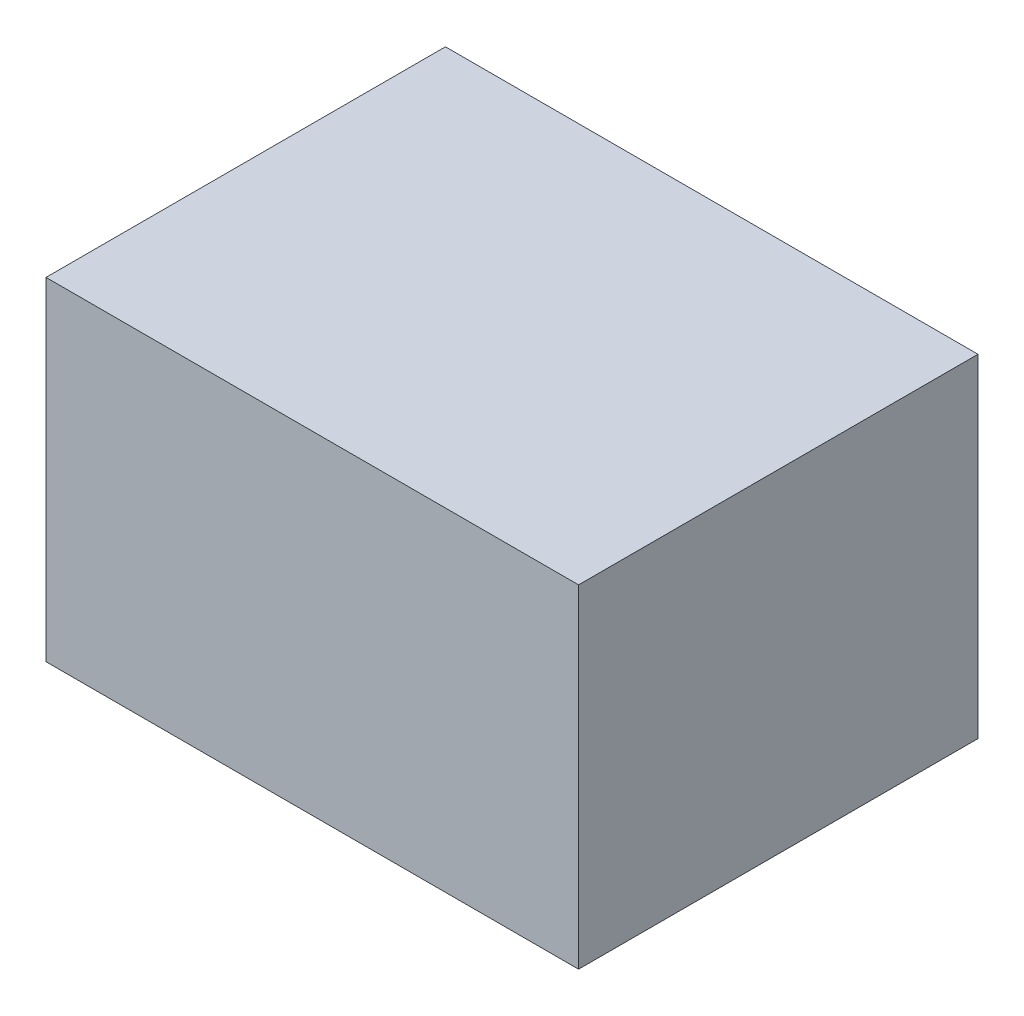
ISO-10303-21;
HEADER;
FILE_DESCRIPTION(('STEP AP214'),'2;1');
FILE_NAME('part.step','',(''),(''),'','','');
FILE_SCHEMA(('AUTOMOTIVE_DESIGN { 1 0 10303 214 1 1 1 1 }'));
ENDSEC;
DATA;
#1=APPLICATION_CONTEXT('core data for automotive mechanical design processes');
#2=APPLICATION_PROTOCOL_DEFINITION('international standard','automotive_design',2000,#1);
#3=PRODUCT_CONTEXT('',#1,'mechanical');
#4=PRODUCT('Part','Part','',(#3));
#5=PRODUCT_RELATED_PRODUCT_CATEGORY('part','',(#4));
#6=PRODUCT_DEFINITION_FORMATION('','',#4);
#7=PRODUCT_DEFINITION_CONTEXT('part definition',#1,'design');
#8=PRODUCT_DEFINITION('design','',#6,#7);
#9=PRODUCT_DEFINITION_SHAPE('','',#8);
#10=(LENGTH_UNIT() NAMED_UNIT(*) SI_UNIT(.MILLI.,.METRE.));
#11=(NAMED_UNIT(*) PLANE_ANGLE_UNIT() SI_UNIT($,.RADIAN.));
#12=(NAMED_UNIT(*) SI_UNIT($,.STERADIAN.) SOLID_ANGLE_UNIT());
#13=UNCERTAINTY_MEASURE_WITH_UNIT(LENGTH_MEASURE(1.E-05),#10,'distance_accuracy_value','');
#14=(GEOMETRIC_REPRESENTATION_CONTEXT(3) GLOBAL_UNCERTAINTY_ASSIGNED_CONTEXT((#13)) GLOBAL_UNIT_ASSIGNED_CONTEXT((#10,
#11,#12)) REPRESENTATION_CONTEXT('',''));
#15=CARTESIAN_POINT('',(0.,0.,0.));
#16=DIRECTION('',(0.,0.,1.));
#17=DIRECTION('',(1.,0.,0.));
#18=AXIS2_PLACEMENT_3D('',#15,#16,#17);
#19=CARTESIAN_POINT('',(0.999998,0.6249924,1.499997));
#20=DIRECTION('',(-1.,0.,0.));
#21=DIRECTION('',(0.,0.,1.));
#22=AXIS2_PLACEMENT_3D('',#19,#20,#21);
#23=PLANE('',#22);
#24=DIRECTION('',(0.,1.,0.));
#25=VECTOR('',#24,1.);
#26=CARTESIAN_POINT('',(0.999998,0.6249924,0.));
#27=LINE('',#26,#25);
#28=CARTESIAN_POINT('',(0.999998,-0.6249924,0.));
#29=VERTEX_POINT('',#28);
#30=CARTESIAN_POINT('',(0.999998,0.6249924,0.));
#31=VERTEX_POINT('',#30);
#32=EDGE_CURVE('E95',#29,#31,#27,.T.);
#33=ORIENTED_EDGE('',*,*,#32,.T.);
#34=DIRECTION('',(0.,0.,-1.));
#35=VECTOR('',#34,1.);
#36=CARTESIAN_POINT('',(0.999998,0.6249924,1.499997));
#37=LINE('',#36,#35);
#38=CARTESIAN_POINT('',(0.999998,0.6249924,1.499997));
#39=VERTEX_POINT('',#38);
#40=EDGE_CURVE('E11',#39,#31,#37,.T.);
#41=ORIENTED_EDGE('',*,*,#40,.F.);
#42=DIRECTION('',(0.,1.,0.));
#43=VECTOR('',#42,1.);
#44=CARTESIAN_POINT('',(0.999998,0.6249924,1.499997));
#45=LINE('',#44,#43);
#46=CARTESIAN_POINT('',(0.999998,-0.6249924,1.499997));
#47=VERTEX_POINT('',#46);
#48=EDGE_CURVE('E83',#47,#39,#45,.T.);
#49=ORIENTED_EDGE('',*,*,#48,.F.);
#50=DIRECTION('',(0.,0.,-1.));
#51=VECTOR('',#50,1.);
#52=CARTESIAN_POINT('',(0.999998,-0.6249924,1.499997));
#53=LINE('',#52,#51);
#54=EDGE_CURVE('E91',#47,#29,#53,.T.);
#55=ORIENTED_EDGE('',*,*,#54,.T.);
#56=EDGE_LOOP('',(#33,#41,#49,#55));
#57=FACE_BOUND('',#56,.T.);
#58=ADVANCED_FACE('F32',(#57),#23,.F.);
#59=CARTESIAN_POINT('',(-0.999998,0.6249924,1.499997));
#60=DIRECTION('',(0.,-1.,0.));
#61=DIRECTION('',(0.,0.,-1.));
#62=AXIS2_PLACEMENT_3D('',#59,#60,#61);
#63=PLANE('',#62);
#64=DIRECTION('',(-1.,0.,0.));
#65=VECTOR('',#64,1.);
#66=CARTESIAN_POINT('',(-0.999998,0.6249924,0.));
#67=LINE('',#66,#65);
#68=CARTESIAN_POINT('',(-0.999998,0.6249924,0.));
#69=VERTEX_POINT('',#68);
#70=EDGE_CURVE('E87',#31,#69,#67,.T.);
#71=ORIENTED_EDGE('',*,*,#70,.T.);
#72=DIRECTION('',(0.,0.,-1.));
#73=VECTOR('',#72,1.);
#74=CARTESIAN_POINT('',(-0.999998,0.6249924,1.499997));
#75=LINE('',#74,#73);
#76=CARTESIAN_POINT('',(-0.999998,0.6249924,1.499997));
#77=VERTEX_POINT('',#76);
#78=EDGE_CURVE('E40',#77,#69,#75,.T.);
#79=ORIENTED_EDGE('',*,*,#78,.F.);
#80=DIRECTION('',(-1.,0.,0.));
#81=VECTOR('',#80,1.);
#82=CARTESIAN_POINT('',(-0.999998,0.6249924,1.499997));
#83=LINE('',#82,#81);
#84=EDGE_CURVE('E78',#39,#77,#83,.T.);
#85=ORIENTED_EDGE('',*,*,#84,.F.);
#86=ORIENTED_EDGE('',*,*,#40,.T.);
#87=EDGE_LOOP('',(#71,#79,#85,#86));
#88=FACE_BOUND('',#87,.T.);
#89=ADVANCED_FACE('F86',(#88),#63,.F.);
#90=CARTESIAN_POINT('',(-0.999998,-0.6249924,1.499997));
#91=DIRECTION('',(1.,0.,0.));
#92=DIRECTION('',(0.,0.,-1.));
#93=AXIS2_PLACEMENT_3D('',#90,#91,#92);
#94=PLANE('',#93);
#95=DIRECTION('',(0.,-1.,0.));
#96=VECTOR('',#95,1.);
#97=CARTESIAN_POINT('',(-0.999998,-0.6249924,0.));
#98=LINE('',#97,#96);
#99=CARTESIAN_POINT('',(-0.999998,-0.6249924,0.));
#100=VERTEX_POINT('',#99);
#101=EDGE_CURVE('E65',#69,#100,#98,.T.);
#102=ORIENTED_EDGE('',*,*,#101,.T.);
#103=DIRECTION('',(0.,0.,-1.));
#104=VECTOR('',#103,1.);
#105=CARTESIAN_POINT('',(-0.999998,-0.6249924,1.499997));
#106=LINE('',#105,#104);
#107=CARTESIAN_POINT('',(-0.999998,-0.6249924,1.499997));
#108=VERTEX_POINT('',#107);
#109=EDGE_CURVE('E88',#108,#100,#106,.T.);
#110=ORIENTED_EDGE('',*,*,#109,.F.);
#111=DIRECTION('',(0.,-1.,0.));
#112=VECTOR('',#111,1.);
#113=CARTESIAN_POINT('',(-0.999998,-0.6249924,1.499997));
#114=LINE('',#113,#112);
#115=EDGE_CURVE('E81',#77,#108,#114,.T.);
#116=ORIENTED_EDGE('',*,*,#115,.F.);
#117=ORIENTED_EDGE('',*,*,#78,.T.);
#118=EDGE_LOOP('',(#102,#110,#116,#117));
#119=FACE_BOUND('',#118,.T.);
#120=ADVANCED_FACE('F89',(#119),#94,.F.);
#121=CARTESIAN_POINT('',(0.999998,-0.6249924,1.499997));
#122=DIRECTION('',(0.,1.,0.));
#123=DIRECTION('',(0.,0.,1.));
#124=AXIS2_PLACEMENT_3D('',#121,#122,#123);
#125=PLANE('',#124);
#126=DIRECTION('',(1.,0.,0.));
#127=VECTOR('',#126,1.);
#128=CARTESIAN_POINT('',(0.999998,-0.6249924,0.));
#129=LINE('',#128,#127);
#130=EDGE_CURVE('E71',#100,#29,#129,.T.);
#131=ORIENTED_EDGE('',*,*,#130,.T.);
#132=ORIENTED_EDGE('',*,*,#54,.F.);
#133=DIRECTION('',(1.,0.,0.));
#134=VECTOR('',#133,1.);
#135=CARTESIAN_POINT('',(0.999998,-0.6249924,1.499997));
#136=LINE('',#135,#134);
#137=EDGE_CURVE('E48',#108,#47,#136,.T.);
#138=ORIENTED_EDGE('',*,*,#137,.F.);
#139=ORIENTED_EDGE('',*,*,#109,.T.);
#140=EDGE_LOOP('',(#131,#132,#138,#139));
#141=FACE_BOUND('',#140,.T.);
#142=ADVANCED_FACE('F102',(#141),#125,.F.);
#143=CARTESIAN_POINT('',(0.,0.,1.499997));
#144=DIRECTION('',(0.,0.,-1.));
#145=DIRECTION('',(-1.,0.,0.));
#146=AXIS2_PLACEMENT_3D('',#143,#144,#145);
#147=PLANE('',#146);
#148=ORIENTED_EDGE('',*,*,#48,.T.);
#149=ORIENTED_EDGE('',*,*,#84,.T.);
#150=ORIENTED_EDGE('',*,*,#115,.T.);
#151=ORIENTED_EDGE('',*,*,#137,.T.);
#152=EDGE_LOOP('',(#148,#149,#150,#151));
#153=FACE_BOUND('',#152,.T.);
#154=ADVANCED_FACE('F79',(#153),#147,.F.);
#155=CARTESIAN_POINT('',(0.,0.,0.));
#156=DIRECTION('',(0.,0.,-1.));
#157=DIRECTION('',(-1.,0.,0.));
#158=AXIS2_PLACEMENT_3D('',#155,#156,#157);
#159=PLANE('',#158);
#160=ORIENTED_EDGE('',*,*,#32,.F.);
#161=ORIENTED_EDGE('',*,*,#130,.F.);
#162=ORIENTED_EDGE('',*,*,#101,.F.);
#163=ORIENTED_EDGE('',*,*,#70,.F.);
#164=EDGE_LOOP('',(#160,#161,#162,#163));
#165=FACE_BOUND('',#164,.T.);
#166=ADVANCED_FACE('F105',(#165),#159,.T.);
#167=CLOSED_SHELL('',(#58,#89,#120,#142,#154,#166));
#168=MANIFOLD_SOLID_BREP('B2',#167);
#169=ADVANCED_BREP_SHAPE_REPRESENTATION('',(#18,#168),#14);
#170=SHAPE_DEFINITION_REPRESENTATION(#9,#169);
ENDSEC;
END-ISO-10303-21;
